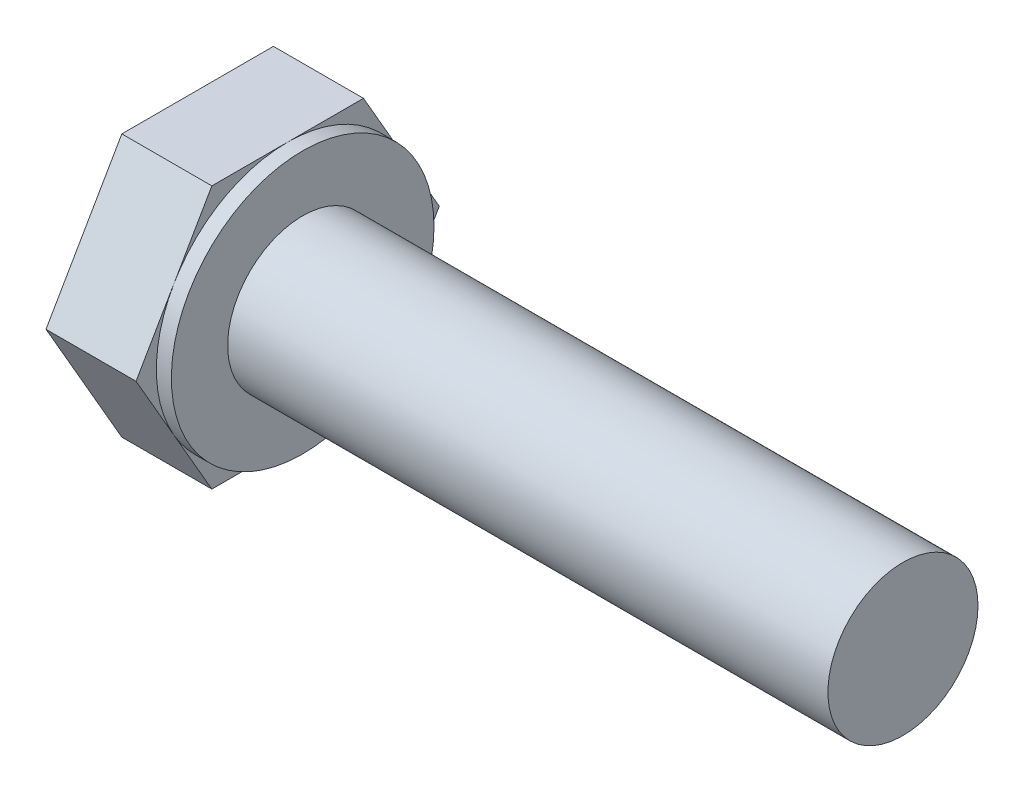
ISO-10303-21;
HEADER;
FILE_DESCRIPTION(('STEP AP214'),'2;1');
FILE_NAME('part.step','',(''),(''),'','','');
FILE_SCHEMA(('AUTOMOTIVE_DESIGN { 1 0 10303 214 1 1 1 1 }'));
ENDSEC;
DATA;
#1=APPLICATION_CONTEXT('core data for automotive mechanical design processes');
#2=APPLICATION_PROTOCOL_DEFINITION('international standard','automotive_design',2000,#1);
#3=PRODUCT_CONTEXT('',#1,'mechanical');
#4=PRODUCT('Part','Part','',(#3));
#5=PRODUCT_RELATED_PRODUCT_CATEGORY('part','',(#4));
#6=PRODUCT_DEFINITION_FORMATION('','',#4);
#7=PRODUCT_DEFINITION_CONTEXT('part definition',#1,'design');
#8=PRODUCT_DEFINITION('design','',#6,#7);
#9=PRODUCT_DEFINITION_SHAPE('','',#8);
#10=(LENGTH_UNIT() NAMED_UNIT(*) SI_UNIT(.MILLI.,.METRE.));
#11=(NAMED_UNIT(*) PLANE_ANGLE_UNIT() SI_UNIT($,.RADIAN.));
#12=(NAMED_UNIT(*) SI_UNIT($,.STERADIAN.) SOLID_ANGLE_UNIT());
#13=UNCERTAINTY_MEASURE_WITH_UNIT(LENGTH_MEASURE(1.E-05),#10,'distance_accuracy_value','');
#14=(GEOMETRIC_REPRESENTATION_CONTEXT(3) GLOBAL_UNCERTAINTY_ASSIGNED_CONTEXT((#13)) GLOBAL_UNIT_ASSIGNED_CONTEXT((#10,
#11,#12)) REPRESENTATION_CONTEXT('',''));
#15=CARTESIAN_POINT('',(0.,0.,0.));
#16=DIRECTION('',(0.,0.,1.));
#17=DIRECTION('',(1.,0.,0.));
#18=AXIS2_PLACEMENT_3D('',#15,#16,#17);
#19=CARTESIAN_POINT('',(0.4,0.,0.));
#20=DIRECTION('',(1.,0.,0.));
#21=DIRECTION('',(0.,0.,-1.));
#22=AXIS2_PLACEMENT_3D('',#19,#20,#21);
#23=PLANE('',#22);
#24=CARTESIAN_POINT('',(0.4,0.,0.));
#25=DIRECTION('',(1.,0.,0.));
#26=DIRECTION('',(0.,0.,-1.));
#27=AXIS2_PLACEMENT_3D('',#24,#25,#26);
#28=CIRCLE('',#27,3.5);
#29=CARTESIAN_POINT('',(0.4,0.,-3.5));
#30=VERTEX_POINT('',#29);
#31=EDGE_CURVE('E126',#30,#30,#28,.T.);
#32=ORIENTED_EDGE('',*,*,#31,.T.);
#33=EDGE_LOOP('',(#32));
#34=FACE_BOUND('',#33,.T.);
#35=CARTESIAN_POINT('',(0.4,0.,0.));
#36=DIRECTION('',(1.,0.,0.));
#37=DIRECTION('',(0.,0.,-1.));
#38=AXIS2_PLACEMENT_3D('',#35,#36,#37);
#39=CIRCLE('',#38,2.);
#40=CARTESIAN_POINT('',(0.4,0.,-2.));
#41=VERTEX_POINT('',#40);
#42=EDGE_CURVE('E349',#41,#41,#39,.T.);
#43=ORIENTED_EDGE('',*,*,#42,.F.);
#44=EDGE_LOOP('',(#43));
#45=FACE_BOUND('',#44,.T.);
#46=ADVANCED_FACE('F33',(#34,#45),#23,.T.);
#47=CARTESIAN_POINT('',(0.,0.,0.));
#48=DIRECTION('',(1.,0.,0.));
#49=DIRECTION('',(0.,0.,-1.));
#50=AXIS2_PLACEMENT_3D('',#47,#48,#49);
#51=PLANE('',#50);
#52=CARTESIAN_POINT('',(0.,0.,0.));
#53=DIRECTION('',(1.,0.,0.));
#54=DIRECTION('',(0.,0.,-1.));
#55=AXIS2_PLACEMENT_3D('',#52,#53,#54);
#56=CIRCLE('',#55,3.5);
#57=CARTESIAN_POINT('',(0.,1.75,-3.03108891324554));
#58=VERTEX_POINT('',#57);
#59=CARTESIAN_POINT('',(0.,3.5,0.));
#60=VERTEX_POINT('',#59);
#61=EDGE_CURVE('E44',#58,#60,#56,.T.);
#62=ORIENTED_EDGE('',*,*,#61,.F.);
#63=DIRECTION('',(0.,0.866025403784439,0.5));
#64=VECTOR('',#63,1.);
#65=CARTESIAN_POINT('',(0.,0.,-4.04145188432738));
#66=LINE('',#65,#64);
#67=CARTESIAN_POINT('',(0.,3.5,-2.02072594216369));
#68=VERTEX_POINT('',#67);
#69=EDGE_CURVE('E111',#58,#68,#66,.T.);
#70=ORIENTED_EDGE('',*,*,#69,.T.);
#71=DIRECTION('',(0.,0.,1.));
#72=VECTOR('',#71,1.);
#73=CARTESIAN_POINT('',(0.,3.5,-2.02072594216369));
#74=LINE('',#73,#72);
#75=EDGE_CURVE('E124',#68,#60,#74,.T.);
#76=ORIENTED_EDGE('',*,*,#75,.T.);
#77=EDGE_LOOP('',(#62,#70,#76));
#78=FACE_BOUND('',#77,.T.);
#79=ADVANCED_FACE('F123',(#78),#51,.T.);
#80=CARTESIAN_POINT('',(0.,1.75,3.03108891324554));
#81=VERTEX_POINT('',#80);
#82=EDGE_CURVE('E11',#60,#81,#56,.T.);
#83=ORIENTED_EDGE('',*,*,#82,.F.);
#84=CARTESIAN_POINT('',(0.,3.5,2.02072594216369));
#85=VERTEX_POINT('',#84);
#86=EDGE_CURVE('E110',#60,#85,#74,.T.);
#87=ORIENTED_EDGE('',*,*,#86,.T.);
#88=DIRECTION('',(0.,-0.866025403784439,0.5));
#89=VECTOR('',#88,1.);
#90=CARTESIAN_POINT('',(0.,3.5,2.02072594216369));
#91=LINE('',#90,#89);
#92=EDGE_CURVE('E156',#85,#81,#91,.T.);
#93=ORIENTED_EDGE('',*,*,#92,.T.);
#94=EDGE_LOOP('',(#83,#87,#93));
#95=FACE_BOUND('',#94,.T.);
#96=ADVANCED_FACE('F209',(#95),#51,.T.);
#97=CARTESIAN_POINT('',(0.,-1.75,3.03108891324554));
#98=VERTEX_POINT('',#97);
#99=EDGE_CURVE('E42',#81,#98,#56,.T.);
#100=ORIENTED_EDGE('',*,*,#99,.F.);
#101=CARTESIAN_POINT('',(0.,0.,4.04145188432738));
#102=VERTEX_POINT('',#101);
#103=EDGE_CURVE('E159',#81,#102,#91,.T.);
#104=ORIENTED_EDGE('',*,*,#103,.T.);
#105=DIRECTION('',(0.,-0.866025403784439,-0.5));
#106=VECTOR('',#105,1.);
#107=CARTESIAN_POINT('',(0.,0.,4.04145188432738));
#108=LINE('',#107,#106);
#109=EDGE_CURVE('E160',#102,#98,#108,.T.);
#110=ORIENTED_EDGE('',*,*,#109,.T.);
#111=EDGE_LOOP('',(#100,#104,#110));
#112=FACE_BOUND('',#111,.T.);
#113=ADVANCED_FACE('F190',(#112),#51,.T.);
#114=CARTESIAN_POINT('',(0.,-3.5,0.));
#115=VERTEX_POINT('',#114);
#116=EDGE_CURVE('E133',#98,#115,#56,.T.);
#117=ORIENTED_EDGE('',*,*,#116,.F.);
#118=CARTESIAN_POINT('',(0.,-3.5,2.02072594216369));
#119=VERTEX_POINT('',#118);
#120=EDGE_CURVE('E158',#98,#119,#108,.T.);
#121=ORIENTED_EDGE('',*,*,#120,.T.);
#122=DIRECTION('',(0.,0.,-1.));
#123=VECTOR('',#122,1.);
#124=CARTESIAN_POINT('',(0.,-3.5,2.02072594216369));
#125=LINE('',#124,#123);
#126=EDGE_CURVE('E164',#119,#115,#125,.T.);
#127=ORIENTED_EDGE('',*,*,#126,.T.);
#128=EDGE_LOOP('',(#117,#121,#127));
#129=FACE_BOUND('',#128,.T.);
#130=ADVANCED_FACE('F192',(#129),#51,.T.);
#131=CARTESIAN_POINT('',(0.,-1.75,-3.03108891324553));
#132=VERTEX_POINT('',#131);
#133=EDGE_CURVE('E131',#115,#132,#56,.T.);
#134=ORIENTED_EDGE('',*,*,#133,.F.);
#135=CARTESIAN_POINT('',(0.,-3.5,-2.02072594216369));
#136=VERTEX_POINT('',#135);
#137=EDGE_CURVE('E163',#115,#136,#125,.T.);
#138=ORIENTED_EDGE('',*,*,#137,.T.);
#139=DIRECTION('',(0.,0.866025403784439,-0.5));
#140=VECTOR('',#139,1.);
#141=CARTESIAN_POINT('',(0.,-3.5,-2.02072594216369));
#142=LINE('',#141,#140);
#143=EDGE_CURVE('E121',#136,#132,#142,.T.);
#144=ORIENTED_EDGE('',*,*,#143,.T.);
#145=EDGE_LOOP('',(#134,#138,#144));
#146=FACE_BOUND('',#145,.T.);
#147=ADVANCED_FACE('F199',(#146),#51,.T.);
#148=CARTESIAN_POINT('',(-2.4,3.5,2.02072594216369));
#149=DIRECTION('',(0.,0.5,0.866025403784439));
#150=DIRECTION('',(0.,-0.866025403784439,0.5));
#151=AXIS2_PLACEMENT_3D('',#148,#149,#150);
#152=PLANE('',#151);
#153=ORIENTED_EDGE('',*,*,#92,.F.);
#154=DIRECTION('',(1.,0.,0.));
#155=VECTOR('',#154,1.);
#156=CARTESIAN_POINT('',(-2.4,3.5,2.02072594216369));
#157=LINE('',#156,#155);
#158=CARTESIAN_POINT('',(-2.4,3.5,2.02072594216369));
#159=VERTEX_POINT('',#158);
#160=EDGE_CURVE('E132',#159,#85,#157,.T.);
#161=ORIENTED_EDGE('',*,*,#160,.F.);
#162=DIRECTION('',(0.,-0.866025403784439,0.5));
#163=VECTOR('',#162,1.);
#164=CARTESIAN_POINT('',(-2.4,3.5,2.02072594216369));
#165=LINE('',#164,#163);
#166=CARTESIAN_POINT('',(-2.4,0.,4.04145188432738));
#167=VERTEX_POINT('',#166);
#168=EDGE_CURVE('E139',#159,#167,#165,.T.);
#169=ORIENTED_EDGE('',*,*,#168,.T.);
#170=DIRECTION('',(1.,0.,0.));
#171=VECTOR('',#170,1.);
#172=CARTESIAN_POINT('',(-2.4,0.,4.04145188432738));
#173=LINE('',#172,#171);
#174=EDGE_CURVE('E37',#167,#102,#173,.T.);
#175=ORIENTED_EDGE('',*,*,#174,.T.);
#176=ORIENTED_EDGE('',*,*,#103,.F.);
#177=EDGE_LOOP('',(#153,#161,#169,#175,#176));
#178=FACE_BOUND('',#177,.T.);
#179=ADVANCED_FACE('F35',(#178),#152,.T.);
#180=CARTESIAN_POINT('',(-2.4,3.5,-2.02072594216369));
#181=DIRECTION('',(0.,1.,0.));
#182=DIRECTION('',(0.,0.,1.));
#183=AXIS2_PLACEMENT_3D('',#180,#181,#182);
#184=PLANE('',#183);
#185=ORIENTED_EDGE('',*,*,#75,.F.);
#186=DIRECTION('',(1.,0.,0.));
#187=VECTOR('',#186,1.);
#188=CARTESIAN_POINT('',(-2.4,3.5,-2.02072594216369));
#189=LINE('',#188,#187);
#190=CARTESIAN_POINT('',(-2.4,3.5,-2.02072594216369));
#191=VERTEX_POINT('',#190);
#192=EDGE_CURVE('E117',#191,#68,#189,.T.);
#193=ORIENTED_EDGE('',*,*,#192,.F.);
#194=DIRECTION('',(0.,0.,1.));
#195=VECTOR('',#194,1.);
#196=CARTESIAN_POINT('',(-2.4,3.5,-2.02072594216369));
#197=LINE('',#196,#195);
#198=EDGE_CURVE('E153',#191,#159,#197,.T.);
#199=ORIENTED_EDGE('',*,*,#198,.T.);
#200=ORIENTED_EDGE('',*,*,#160,.T.);
#201=ORIENTED_EDGE('',*,*,#86,.F.);
#202=EDGE_LOOP('',(#185,#193,#199,#200,#201));
#203=FACE_BOUND('',#202,.T.);
#204=ADVANCED_FACE('F208',(#203),#184,.T.);
#205=CARTESIAN_POINT('',(-2.4,0.,-4.04145188432738));
#206=DIRECTION('',(0.,0.5,-0.866025403784439));
#207=DIRECTION('',(0.,0.866025403784439,0.5));
#208=AXIS2_PLACEMENT_3D('',#205,#206,#207);
#209=PLANE('',#208);
#210=CARTESIAN_POINT('',(0.,0.,-4.04145188432738));
#211=VERTEX_POINT('',#210);
#212=EDGE_CURVE('E104',#211,#58,#66,.T.);
#213=ORIENTED_EDGE('',*,*,#212,.F.);
#214=DIRECTION('',(1.,0.,0.));
#215=VECTOR('',#214,1.);
#216=CARTESIAN_POINT('',(-2.4,0.,-4.04145188432738));
#217=LINE('',#216,#215);
#218=CARTESIAN_POINT('',(-2.4,0.,-4.04145188432738));
#219=VERTEX_POINT('',#218);
#220=EDGE_CURVE('E171',#219,#211,#217,.T.);
#221=ORIENTED_EDGE('',*,*,#220,.F.);
#222=DIRECTION('',(0.,0.866025403784439,0.5));
#223=VECTOR('',#222,1.);
#224=CARTESIAN_POINT('',(-2.4,0.,-4.04145188432738));
#225=LINE('',#224,#223);
#226=EDGE_CURVE('E151',#219,#191,#225,.T.);
#227=ORIENTED_EDGE('',*,*,#226,.T.);
#228=ORIENTED_EDGE('',*,*,#192,.T.);
#229=ORIENTED_EDGE('',*,*,#69,.F.);
#230=EDGE_LOOP('',(#213,#221,#227,#228,#229));
#231=FACE_BOUND('',#230,.T.);
#232=ADVANCED_FACE('F115',(#231),#209,.T.);
#233=CARTESIAN_POINT('',(-2.4,-3.5,-2.02072594216369));
#234=DIRECTION('',(0.,-0.5,-0.866025403784439));
#235=DIRECTION('',(0.,0.866025403784439,-0.5));
#236=AXIS2_PLACEMENT_3D('',#233,#234,#235);
#237=PLANE('',#236);
#238=ORIENTED_EDGE('',*,*,#143,.F.);
#239=DIRECTION('',(1.,0.,0.));
#240=VECTOR('',#239,1.);
#241=CARTESIAN_POINT('',(-2.4,-3.5,-2.02072594216369));
#242=LINE('',#241,#240);
#243=CARTESIAN_POINT('',(-2.4,-3.5,-2.02072594216369));
#244=VERTEX_POINT('',#243);
#245=EDGE_CURVE('E173',#244,#136,#242,.T.);
#246=ORIENTED_EDGE('',*,*,#245,.F.);
#247=DIRECTION('',(0.,0.866025403784439,-0.5));
#248=VECTOR('',#247,1.);
#249=CARTESIAN_POINT('',(-2.4,-3.5,-2.02072594216369));
#250=LINE('',#249,#248);
#251=EDGE_CURVE('E148',#244,#219,#250,.T.);
#252=ORIENTED_EDGE('',*,*,#251,.T.);
#253=ORIENTED_EDGE('',*,*,#220,.T.);
#254=EDGE_CURVE('E107',#132,#211,#142,.T.);
#255=ORIENTED_EDGE('',*,*,#254,.F.);
#256=EDGE_LOOP('',(#238,#246,#252,#253,#255));
#257=FACE_BOUND('',#256,.T.);
#258=ADVANCED_FACE('F201',(#257),#237,.T.);
#259=CARTESIAN_POINT('',(-2.4,-3.5,2.02072594216369));
#260=DIRECTION('',(0.,-1.,0.));
#261=DIRECTION('',(0.,0.,-1.));
#262=AXIS2_PLACEMENT_3D('',#259,#260,#261);
#263=PLANE('',#262);
#264=ORIENTED_EDGE('',*,*,#126,.F.);
#265=DIRECTION('',(1.,0.,0.));
#266=VECTOR('',#265,1.);
#267=CARTESIAN_POINT('',(-2.4,-3.5,2.02072594216369));
#268=LINE('',#267,#266);
#269=CARTESIAN_POINT('',(-2.4,-3.5,2.02072594216369));
#270=VERTEX_POINT('',#269);
#271=EDGE_CURVE('E175',#270,#119,#268,.T.);
#272=ORIENTED_EDGE('',*,*,#271,.F.);
#273=DIRECTION('',(0.,0.,-1.));
#274=VECTOR('',#273,1.);
#275=CARTESIAN_POINT('',(-2.4,-3.5,2.02072594216369));
#276=LINE('',#275,#274);
#277=EDGE_CURVE('E145',#270,#244,#276,.T.);
#278=ORIENTED_EDGE('',*,*,#277,.T.);
#279=ORIENTED_EDGE('',*,*,#245,.T.);
#280=ORIENTED_EDGE('',*,*,#137,.F.);
#281=EDGE_LOOP('',(#264,#272,#278,#279,#280));
#282=FACE_BOUND('',#281,.T.);
#283=ADVANCED_FACE('F195',(#282),#263,.T.);
#284=CARTESIAN_POINT('',(-2.4,0.,4.04145188432738));
#285=DIRECTION('',(0.,-0.5,0.866025403784439));
#286=DIRECTION('',(0.,-0.866025403784439,-0.5));
#287=AXIS2_PLACEMENT_3D('',#284,#285,#286);
#288=PLANE('',#287);
#289=ORIENTED_EDGE('',*,*,#109,.F.);
#290=ORIENTED_EDGE('',*,*,#174,.F.);
#291=DIRECTION('',(0.,-0.866025403784439,-0.5));
#292=VECTOR('',#291,1.);
#293=CARTESIAN_POINT('',(-2.4,0.,4.04145188432738));
#294=LINE('',#293,#292);
#295=EDGE_CURVE('E142',#167,#270,#294,.T.);
#296=ORIENTED_EDGE('',*,*,#295,.T.);
#297=ORIENTED_EDGE('',*,*,#271,.T.);
#298=ORIENTED_EDGE('',*,*,#120,.F.);
#299=EDGE_LOOP('',(#289,#290,#296,#297,#298));
#300=FACE_BOUND('',#299,.T.);
#301=ADVANCED_FACE('F187',(#300),#288,.T.);
#302=CARTESIAN_POINT('',(-2.4,0.,0.));
#303=DIRECTION('',(1.,0.,0.));
#304=DIRECTION('',(0.,0.,-1.));
#305=AXIS2_PLACEMENT_3D('',#302,#303,#304);
#306=PLANE('',#305);
#307=ORIENTED_EDGE('',*,*,#168,.F.);
#308=ORIENTED_EDGE('',*,*,#198,.F.);
#309=ORIENTED_EDGE('',*,*,#226,.F.);
#310=ORIENTED_EDGE('',*,*,#251,.F.);
#311=ORIENTED_EDGE('',*,*,#277,.F.);
#312=ORIENTED_EDGE('',*,*,#295,.F.);
#313=EDGE_LOOP('',(#307,#308,#309,#310,#311,#312));
#314=FACE_BOUND('',#313,.T.);
#315=ADVANCED_FACE('F206',(#314),#306,.F.);
#316=EDGE_CURVE('E57',#132,#58,#56,.T.);
#317=ORIENTED_EDGE('',*,*,#316,.F.);
#318=ORIENTED_EDGE('',*,*,#254,.T.);
#319=ORIENTED_EDGE('',*,*,#212,.T.);
#320=EDGE_LOOP('',(#317,#318,#319));
#321=FACE_BOUND('',#320,.T.);
#322=ADVANCED_FACE('F106',(#321),#51,.T.);
#323=CARTESIAN_POINT('',(0.4,0.,0.));
#324=DIRECTION('',(-1.,0.,0.));
#325=DIRECTION('',(0.,0.,1.));
#326=AXIS2_PLACEMENT_3D('',#323,#324,#325);
#327=CYLINDRICAL_SURFACE('',#326,3.5);
#328=ORIENTED_EDGE('',*,*,#31,.F.);
#329=EDGE_LOOP('',(#328));
#330=FACE_BOUND('',#329,.T.);
#331=ORIENTED_EDGE('',*,*,#61,.T.);
#332=ORIENTED_EDGE('',*,*,#82,.T.);
#333=ORIENTED_EDGE('',*,*,#99,.T.);
#334=ORIENTED_EDGE('',*,*,#116,.T.);
#335=ORIENTED_EDGE('',*,*,#133,.T.);
#336=ORIENTED_EDGE('',*,*,#316,.T.);
#337=EDGE_LOOP('',(#331,#332,#333,#334,#335,#336));
#338=FACE_BOUND('',#337,.T.);
#339=ADVANCED_FACE('F129',(#330,#338),#327,.T.);
#340=CARTESIAN_POINT('',(16.4,0.,0.));
#341=DIRECTION('',(-1.,0.,0.));
#342=DIRECTION('',(0.,0.,1.));
#343=AXIS2_PLACEMENT_3D('',#340,#341,#342);
#344=CYLINDRICAL_SURFACE('',#343,2.);
#345=CARTESIAN_POINT('',(16.4,0.,0.));
#346=DIRECTION('',(1.,0.,0.));
#347=DIRECTION('',(0.,0.,-1.));
#348=AXIS2_PLACEMENT_3D('',#345,#346,#347);
#349=CIRCLE('',#348,2.);
#350=CARTESIAN_POINT('',(16.4,0.,-2.));
#351=VERTEX_POINT('',#350);
#352=EDGE_CURVE('E127',#351,#351,#349,.T.);
#353=ORIENTED_EDGE('',*,*,#352,.F.);
#354=EDGE_LOOP('',(#353));
#355=FACE_BOUND('',#354,.T.);
#356=ORIENTED_EDGE('',*,*,#42,.T.);
#357=EDGE_LOOP('',(#356));
#358=FACE_BOUND('',#357,.T.);
#359=ADVANCED_FACE('F227',(#355,#358),#344,.T.);
#360=CARTESIAN_POINT('',(16.4,0.,0.));
#361=DIRECTION('',(1.,0.,0.));
#362=DIRECTION('',(0.,0.,-1.));
#363=AXIS2_PLACEMENT_3D('',#360,#361,#362);
#364=PLANE('',#363);
#365=ORIENTED_EDGE('',*,*,#352,.T.);
#366=EDGE_LOOP('',(#365));
#367=FACE_BOUND('',#366,.T.);
#368=ADVANCED_FACE('F335',(#367),#364,.T.);
#369=CLOSED_SHELL('',(#46,#79,#96,#113,#130,#147,#179,#204,#232,#258,#283,#301,#315,#322,#339,
#359,#368));
#370=MANIFOLD_SOLID_BREP('B2',#369);
#371=ADVANCED_BREP_SHAPE_REPRESENTATION('',(#18,#370),#14);
#372=SHAPE_DEFINITION_REPRESENTATION(#9,#371);
ENDSEC;
END-ISO-10303-21;
